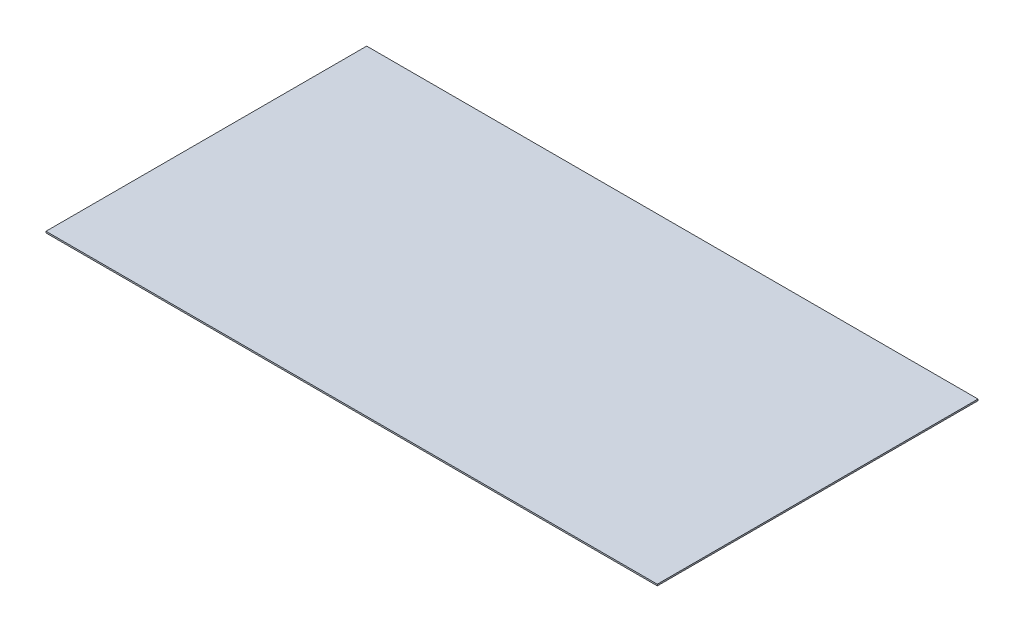
ISO-10303-21;
HEADER;
FILE_DESCRIPTION(('STEP AP214'),'2;1');
FILE_NAME('part.step','',(''),(''),'','','');
FILE_SCHEMA(('AUTOMOTIVE_DESIGN { 1 0 10303 214 1 1 1 1 }'));
ENDSEC;
DATA;
#1=APPLICATION_CONTEXT('core data for automotive mechanical design processes');
#2=APPLICATION_PROTOCOL_DEFINITION('international standard','automotive_design',2000,#1);
#3=PRODUCT_CONTEXT('',#1,'mechanical');
#4=PRODUCT('Part','Part','',(#3));
#5=PRODUCT_RELATED_PRODUCT_CATEGORY('part','',(#4));
#6=PRODUCT_DEFINITION_FORMATION('','',#4);
#7=PRODUCT_DEFINITION_CONTEXT('part definition',#1,'design');
#8=PRODUCT_DEFINITION('design','',#6,#7);
#9=PRODUCT_DEFINITION_SHAPE('','',#8);
#10=(LENGTH_UNIT() NAMED_UNIT(*) SI_UNIT(.MILLI.,.METRE.));
#11=(NAMED_UNIT(*) PLANE_ANGLE_UNIT() SI_UNIT($,.RADIAN.));
#12=(NAMED_UNIT(*) SI_UNIT($,.STERADIAN.) SOLID_ANGLE_UNIT());
#13=UNCERTAINTY_MEASURE_WITH_UNIT(LENGTH_MEASURE(1.E-05),#10,'distance_accuracy_value','');
#14=(GEOMETRIC_REPRESENTATION_CONTEXT(3) GLOBAL_UNCERTAINTY_ASSIGNED_CONTEXT((#13)) GLOBAL_UNIT_ASSIGNED_CONTEXT((#10,
#11,#12)) REPRESENTATION_CONTEXT('',''));
#15=CARTESIAN_POINT('',(0.,0.,0.));
#16=DIRECTION('',(0.,0.,1.));
#17=DIRECTION('',(1.,0.,0.));
#18=AXIS2_PLACEMENT_3D('',#15,#16,#17);
#19=CARTESIAN_POINT('',(0.,270.,0.));
#20=DIRECTION('',(0.,-1.,0.));
#21=DIRECTION('',(0.,0.,-1.));
#22=AXIS2_PLACEMENT_3D('',#19,#20,#21);
#23=PLANE('',#22);
#24=DIRECTION('',(-1.,0.,0.));
#25=VECTOR('',#24,1.);
#26=CARTESIAN_POINT('',(-29.999999999999,270.,-1140.));
#27=LINE('',#26,#25);
#28=CARTESIAN_POINT('',(-29.999999999999,270.,-1140.));
#29=VERTEX_POINT('',#28);
#30=CARTESIAN_POINT('',(-639.999999999999,270.,-1140.));
#31=VERTEX_POINT('',#30);
#32=EDGE_CURVE('E57',#29,#31,#27,.T.);
#33=ORIENTED_EDGE('',*,*,#32,.F.);
#34=DIRECTION('',(0.,0.,-1.));
#35=VECTOR('',#34,1.);
#36=CARTESIAN_POINT('',(-29.9999999999992,270.,-820.));
#37=LINE('',#36,#35);
#38=CARTESIAN_POINT('',(-29.9999999999991,270.,-820.));
#39=VERTEX_POINT('',#38);
#40=EDGE_CURVE('E52',#39,#29,#37,.T.);
#41=ORIENTED_EDGE('',*,*,#40,.F.);
#42=DIRECTION('',(1.,0.,0.));
#43=VECTOR('',#42,1.);
#44=CARTESIAN_POINT('',(-29.9999999999992,270.,-820.));
#45=LINE('',#44,#43);
#46=CARTESIAN_POINT('',(-639.999999999999,270.,-820.));
#47=VERTEX_POINT('',#46);
#48=EDGE_CURVE('E67',#47,#39,#45,.T.);
#49=ORIENTED_EDGE('',*,*,#48,.F.);
#50=DIRECTION('',(0.,0.,1.));
#51=VECTOR('',#50,1.);
#52=CARTESIAN_POINT('',(-639.999999999999,270.,-820.));
#53=LINE('',#52,#51);
#54=EDGE_CURVE('E19',#31,#47,#53,.T.);
#55=ORIENTED_EDGE('',*,*,#54,.F.);
#56=EDGE_LOOP('',(#33,#41,#49,#55));
#57=FACE_BOUND('',#56,.T.);
#58=ADVANCED_FACE('F16',(#57),#23,.T.);
#59=CARTESIAN_POINT('',(-639.999999999999,271.5,-820.));
#60=DIRECTION('',(-1.,0.,0.));
#61=DIRECTION('',(0.,0.,1.));
#62=AXIS2_PLACEMENT_3D('',#59,#60,#61);
#63=PLANE('',#62);
#64=DIRECTION('',(0.,0.,-1.));
#65=VECTOR('',#64,1.);
#66=CARTESIAN_POINT('',(-639.999999999999,271.5,0.));
#67=LINE('',#66,#65);
#68=CARTESIAN_POINT('',(-639.999999999999,271.5,-820.));
#69=VERTEX_POINT('',#68);
#70=CARTESIAN_POINT('',(-639.999999999999,271.5,-1140.));
#71=VERTEX_POINT('',#70);
#72=EDGE_CURVE('E73',#69,#71,#67,.T.);
#73=ORIENTED_EDGE('',*,*,#72,.T.);
#74=DIRECTION('',(0.,1.,0.));
#75=VECTOR('',#74,1.);
#76=CARTESIAN_POINT('',(-639.999999999999,271.5,-1140.));
#77=LINE('',#76,#75);
#78=EDGE_CURVE('E62',#31,#71,#77,.T.);
#79=ORIENTED_EDGE('',*,*,#78,.F.);
#80=ORIENTED_EDGE('',*,*,#54,.T.);
#81=DIRECTION('',(0.,1.,0.));
#82=VECTOR('',#81,1.);
#83=CARTESIAN_POINT('',(-639.999999999999,271.5,-820.000000000001));
#84=LINE('',#83,#82);
#85=EDGE_CURVE('E80',#69,#47,#84,.F.);
#86=ORIENTED_EDGE('',*,*,#85,.F.);
#87=EDGE_LOOP('',(#73,#79,#80,#86));
#88=FACE_BOUND('',#87,.T.);
#89=ADVANCED_FACE('F72',(#88),#63,.T.);
#90=CARTESIAN_POINT('',(-29.999999999999,271.5,-1140.));
#91=DIRECTION('',(0.,0.,-1.));
#92=DIRECTION('',(-1.,0.,0.));
#93=AXIS2_PLACEMENT_3D('',#90,#91,#92);
#94=PLANE('',#93);
#95=DIRECTION('',(1.,0.,0.));
#96=VECTOR('',#95,1.);
#97=CARTESIAN_POINT('',(0.,271.5,-1140.));
#98=LINE('',#97,#96);
#99=CARTESIAN_POINT('',(-29.999999999999,271.5,-1140.));
#100=VERTEX_POINT('',#99);
#101=EDGE_CURVE('E83',#71,#100,#98,.T.);
#102=ORIENTED_EDGE('',*,*,#101,.T.);
#103=DIRECTION('',(0.,1.,0.));
#104=VECTOR('',#103,1.);
#105=CARTESIAN_POINT('',(-29.999999999999,271.5,-1140.));
#106=LINE('',#105,#104);
#107=EDGE_CURVE('E64',#29,#100,#106,.T.);
#108=ORIENTED_EDGE('',*,*,#107,.F.);
#109=ORIENTED_EDGE('',*,*,#32,.T.);
#110=ORIENTED_EDGE('',*,*,#78,.T.);
#111=EDGE_LOOP('',(#102,#108,#109,#110));
#112=FACE_BOUND('',#111,.T.);
#113=ADVANCED_FACE('F60',(#112),#94,.T.);
#114=CARTESIAN_POINT('',(-29.9999999999992,271.5,-820.));
#115=DIRECTION('',(1.,0.,0.));
#116=DIRECTION('',(0.,0.,-1.));
#117=AXIS2_PLACEMENT_3D('',#114,#115,#116);
#118=PLANE('',#117);
#119=DIRECTION('',(0.,0.,-1.));
#120=VECTOR('',#119,1.);
#121=CARTESIAN_POINT('',(-29.999999999999,271.5,0.));
#122=LINE('',#121,#120);
#123=CARTESIAN_POINT('',(-29.9999999999991,271.5,-820.));
#124=VERTEX_POINT('',#123);
#125=EDGE_CURVE('E25',#100,#124,#122,.F.);
#126=ORIENTED_EDGE('',*,*,#125,.T.);
#127=DIRECTION('',(0.,1.,0.));
#128=VECTOR('',#127,1.);
#129=CARTESIAN_POINT('',(-29.9999999999992,271.5,-820.));
#130=LINE('',#129,#128);
#131=EDGE_CURVE('E33',#39,#124,#130,.T.);
#132=ORIENTED_EDGE('',*,*,#131,.F.);
#133=ORIENTED_EDGE('',*,*,#40,.T.);
#134=ORIENTED_EDGE('',*,*,#107,.T.);
#135=EDGE_LOOP('',(#126,#132,#133,#134));
#136=FACE_BOUND('',#135,.T.);
#137=ADVANCED_FACE('F87',(#136),#118,.T.);
#138=CARTESIAN_POINT('',(-29.9999999999992,271.5,-820.));
#139=DIRECTION('',(0.,0.,1.));
#140=DIRECTION('',(1.,0.,0.));
#141=AXIS2_PLACEMENT_3D('',#138,#139,#140);
#142=PLANE('',#141);
#143=DIRECTION('',(1.,0.,0.));
#144=VECTOR('',#143,1.);
#145=CARTESIAN_POINT('',(0.,271.5,-820.));
#146=LINE('',#145,#144);
#147=EDGE_CURVE('E11',#124,#69,#146,.F.);
#148=ORIENTED_EDGE('',*,*,#147,.T.);
#149=ORIENTED_EDGE('',*,*,#85,.T.);
#150=ORIENTED_EDGE('',*,*,#48,.T.);
#151=ORIENTED_EDGE('',*,*,#131,.T.);
#152=EDGE_LOOP('',(#148,#149,#150,#151));
#153=FACE_BOUND('',#152,.T.);
#154=ADVANCED_FACE('F90',(#153),#142,.T.);
#155=CARTESIAN_POINT('',(0.,271.5,0.));
#156=DIRECTION('',(0.,-1.,0.));
#157=DIRECTION('',(0.,0.,-1.));
#158=AXIS2_PLACEMENT_3D('',#155,#156,#157);
#159=PLANE('',#158);
#160=ORIENTED_EDGE('',*,*,#125,.F.);
#161=ORIENTED_EDGE('',*,*,#101,.F.);
#162=ORIENTED_EDGE('',*,*,#72,.F.);
#163=ORIENTED_EDGE('',*,*,#147,.F.);
#164=EDGE_LOOP('',(#160,#161,#162,#163));
#165=FACE_BOUND('',#164,.T.);
#166=ADVANCED_FACE('F89',(#165),#159,.F.);
#167=CLOSED_SHELL('',(#58,#89,#113,#137,#154,#166));
#168=MANIFOLD_SOLID_BREP('B1',#167);
#169=ADVANCED_BREP_SHAPE_REPRESENTATION('',(#18,#168),#14);
#170=SHAPE_DEFINITION_REPRESENTATION(#9,#169);
ENDSEC;
END-ISO-10303-21;
